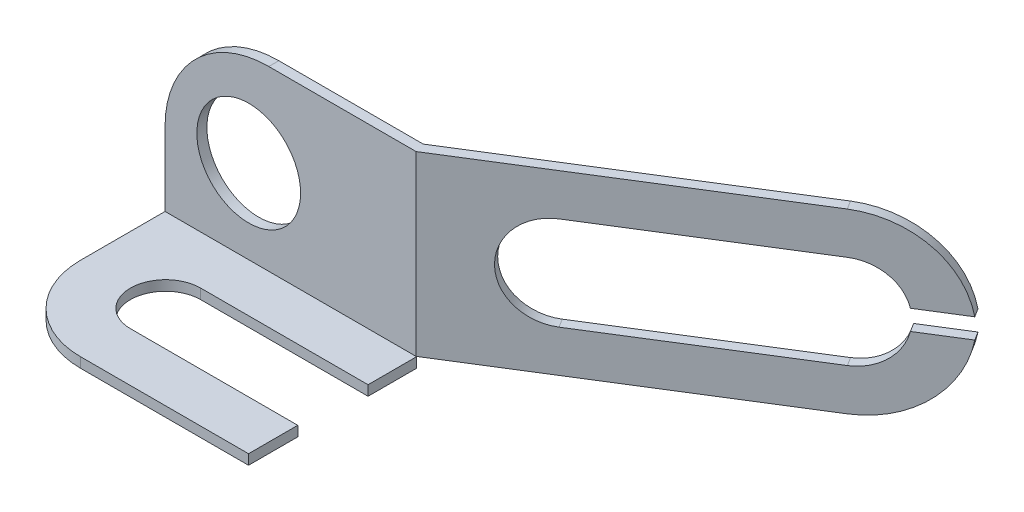
ISO-10303-21;
HEADER;
FILE_DESCRIPTION(('STEP AP214'),'2;1');
FILE_NAME('part.step','',(''),(''),'','','');
FILE_SCHEMA(('AUTOMOTIVE_DESIGN { 1 0 10303 214 1 1 1 1 }'));
ENDSEC;
DATA;
#1=APPLICATION_CONTEXT('core data for automotive mechanical design processes');
#2=APPLICATION_PROTOCOL_DEFINITION('international standard','automotive_design',2000,#1);
#3=PRODUCT_CONTEXT('',#1,'mechanical');
#4=PRODUCT('Part','Part','',(#3));
#5=PRODUCT_RELATED_PRODUCT_CATEGORY('part','',(#4));
#6=PRODUCT_DEFINITION_FORMATION('','',#4);
#7=PRODUCT_DEFINITION_CONTEXT('part definition',#1,'design');
#8=PRODUCT_DEFINITION('design','',#6,#7);
#9=PRODUCT_DEFINITION_SHAPE('','',#8);
#10=(LENGTH_UNIT() NAMED_UNIT(*) SI_UNIT(.MILLI.,.METRE.));
#11=(NAMED_UNIT(*) PLANE_ANGLE_UNIT() SI_UNIT($,.RADIAN.));
#12=(NAMED_UNIT(*) SI_UNIT($,.STERADIAN.) SOLID_ANGLE_UNIT());
#13=UNCERTAINTY_MEASURE_WITH_UNIT(LENGTH_MEASURE(1.E-05),#10,'distance_accuracy_value','');
#14=(GEOMETRIC_REPRESENTATION_CONTEXT(3) GLOBAL_UNCERTAINTY_ASSIGNED_CONTEXT((#13)) GLOBAL_UNIT_ASSIGNED_CONTEXT((#10,
#11,#12)) REPRESENTATION_CONTEXT('',''));
#15=CARTESIAN_POINT('',(0.,0.,0.));
#16=DIRECTION('',(0.,0.,1.));
#17=DIRECTION('',(1.,0.,0.));
#18=AXIS2_PLACEMENT_3D('',#15,#16,#17);
#19=CARTESIAN_POINT('',(0.116932518822949,0.44,-0.56));
#20=DIRECTION('',(0.,0.,-1.));
#21=DIRECTION('',(-1.,0.,0.));
#22=AXIS2_PLACEMENT_3D('',#19,#20,#21);
#23=PLANE('',#22);
#24=CARTESIAN_POINT('',(-0.00306748117705072,0.5,-0.56));
#25=DIRECTION('',(0.,0.,1.));
#26=DIRECTION('',(1.,0.,0.));
#27=AXIS2_PLACEMENT_3D('',#24,#25,#26);
#28=CIRCLE('',#27,0.31);
#29=CARTESIAN_POINT('',(0.306932518822949,0.5,-0.56));
#30=VERTEX_POINT('',#29);
#31=EDGE_CURVE('E290',#30,#30,#28,.T.);
#32=ORIENTED_EDGE('',*,*,#31,.T.);
#33=EDGE_LOOP('',(#32));
#34=FACE_BOUND('',#33,.T.);
#35=DIRECTION('',(-1.,0.,0.));
#36=VECTOR('',#35,1.);
#37=CARTESIAN_POINT('',(0.116932518822954,1.06,-0.56));
#38=LINE('',#37,#36);
#39=CARTESIAN_POINT('',(0.979727795677421,1.06,-0.56));
#40=VERTEX_POINT('',#39);
#41=CARTESIAN_POINT('',(0.116932518822954,1.06,-0.56));
#42=VERTEX_POINT('',#41);
#43=EDGE_CURVE('E93',#40,#42,#38,.T.);
#44=ORIENTED_EDGE('',*,*,#43,.F.);
#45=DIRECTION('',(0.,-1.,0.));
#46=VECTOR('',#45,1.);
#47=CARTESIAN_POINT('',(0.979727795677421,0.44,-0.56));
#48=LINE('',#47,#46);
#49=CARTESIAN_POINT('',(0.979727795677421,0.,-0.56));
#50=VERTEX_POINT('',#49);
#51=EDGE_CURVE('E12',#40,#50,#48,.T.);
#52=ORIENTED_EDGE('',*,*,#51,.T.);
#53=DIRECTION('',(1.,0.,0.));
#54=VECTOR('',#53,1.);
#55=CARTESIAN_POINT('',(-0.503067481177051,0.,-0.56));
#56=LINE('',#55,#54);
#57=CARTESIAN_POINT('',(-0.503067481177051,0.,-0.56));
#58=VERTEX_POINT('',#57);
#59=EDGE_CURVE('E167',#58,#50,#56,.T.);
#60=ORIENTED_EDGE('',*,*,#59,.F.);
#61=DIRECTION('',(0.,-1.,0.));
#62=VECTOR('',#61,1.);
#63=CARTESIAN_POINT('',(-0.503067481177051,0.,-0.56));
#64=LINE('',#63,#62);
#65=CARTESIAN_POINT('',(-0.503067481177051,0.439999999999996,-0.56));
#66=VERTEX_POINT('',#65);
#67=EDGE_CURVE('E306',#66,#58,#64,.T.);
#68=ORIENTED_EDGE('',*,*,#67,.F.);
#69=CARTESIAN_POINT('',(0.116932518822949,0.44,-0.56));
#70=DIRECTION('',(0.,0.,1.));
#71=DIRECTION('',(-1.,0.,0.));
#72=AXIS2_PLACEMENT_3D('',#69,#70,#71);
#73=CIRCLE('',#72,0.62);
#74=EDGE_CURVE('E303',#42,#66,#73,.T.);
#75=ORIENTED_EDGE('',*,*,#74,.F.);
#76=EDGE_LOOP('',(#44,#52,#60,#68,#75));
#77=FACE_BOUND('',#76,.T.);
#78=ADVANCED_FACE('F49',(#34,#77),#23,.T.);
#79=CARTESIAN_POINT('',(-0.503067481177051,0.,-0.56));
#80=DIRECTION('',(0.,-1.,0.));
#81=DIRECTION('',(0.,0.,-1.));
#82=AXIS2_PLACEMENT_3D('',#79,#80,#81);
#83=PLANE('',#82);
#84=DIRECTION('',(0.848048096156427,0.,-0.529919264233203));
#85=VECTOR('',#84,1.);
#86=CARTESIAN_POINT('',(0.99693251882295,0.,-0.5));
#87=LINE('',#86,#85);
#88=CARTESIAN_POINT('',(0.99693251882295,0.,-0.5));
#89=VERTEX_POINT('',#88);
#90=CARTESIAN_POINT('',(2.58278245863547,0.,-1.49094902411609));
#91=VERTEX_POINT('',#90);
#92=EDGE_CURVE('E224',#89,#91,#87,.T.);
#93=ORIENTED_EDGE('',*,*,#92,.F.);
#94=DIRECTION('',(1.,0.,0.));
#95=VECTOR('',#94,1.);
#96=CARTESIAN_POINT('',(-0.503067481177051,0.,-0.5));
#97=LINE('',#96,#95);
#98=CARTESIAN_POINT('',(-0.503067481177051,0.,-0.5));
#99=VERTEX_POINT('',#98);
#100=EDGE_CURVE('E294',#99,#89,#97,.T.);
#101=ORIENTED_EDGE('',*,*,#100,.F.);
#102=DIRECTION('',(0.,0.,1.));
#103=VECTOR('',#102,1.);
#104=CARTESIAN_POINT('',(-0.503067481177051,0.,-0.56));
#105=LINE('',#104,#103);
#106=EDGE_CURVE('E59',#58,#99,#105,.T.);
#107=ORIENTED_EDGE('',*,*,#106,.F.);
#108=ORIENTED_EDGE('',*,*,#59,.T.);
#109=DIRECTION('',(0.848048096156427,0.,-0.529919264233203));
#110=VECTOR('',#109,1.);
#111=CARTESIAN_POINT('',(0.965137362968957,0.,-0.550882885769386));
#112=LINE('',#111,#110);
#113=CARTESIAN_POINT('',(2.55098730278148,0.,-1.54183190988548));
#114=VERTEX_POINT('',#113);
#115=EDGE_CURVE('E163',#50,#114,#112,.T.);
#116=ORIENTED_EDGE('',*,*,#115,.T.);
#117=DIRECTION('',(0.529919264233203,0.,0.848048096156427));
#118=VECTOR('',#117,1.);
#119=CARTESIAN_POINT('',(2.55098730278148,0.,-1.54183190988548));
#120=LINE('',#119,#118);
#121=EDGE_CURVE('E165',#114,#91,#120,.T.);
#122=ORIENTED_EDGE('',*,*,#121,.T.);
#123=EDGE_LOOP('',(#93,#101,#107,#108,#116,#122));
#124=FACE_BOUND('',#123,.T.);
#125=ADVANCED_FACE('F51',(#124),#83,.T.);
#126=CARTESIAN_POINT('',(-0.503067481177051,0.,-0.56));
#127=DIRECTION('',(-1.,0.,0.));
#128=DIRECTION('',(0.,0.,1.));
#129=AXIS2_PLACEMENT_3D('',#126,#127,#128);
#130=PLANE('',#129);
#131=DIRECTION('',(0.,-1.,0.));
#132=VECTOR('',#131,1.);
#133=CARTESIAN_POINT('',(-0.503067481177051,0.,-0.5));
#134=LINE('',#133,#132);
#135=CARTESIAN_POINT('',(-0.503067481177051,0.439999999999996,-0.5));
#136=VERTEX_POINT('',#135);
#137=EDGE_CURVE('E300',#136,#99,#134,.T.);
#138=ORIENTED_EDGE('',*,*,#137,.F.);
#139=DIRECTION('',(0.,0.,1.));
#140=VECTOR('',#139,1.);
#141=CARTESIAN_POINT('',(-0.503067481177051,0.439999999999996,-0.56));
#142=LINE('',#141,#140);
#143=EDGE_CURVE('E84',#66,#136,#142,.T.);
#144=ORIENTED_EDGE('',*,*,#143,.F.);
#145=ORIENTED_EDGE('',*,*,#67,.T.);
#146=ORIENTED_EDGE('',*,*,#106,.T.);
#147=EDGE_LOOP('',(#138,#144,#145,#146));
#148=FACE_BOUND('',#147,.T.);
#149=ADVANCED_FACE('F349',(#148),#130,.T.);
#150=CARTESIAN_POINT('',(0.116932518822949,0.44,-0.56));
#151=DIRECTION('',(0.,0.,1.));
#152=DIRECTION('',(1.,0.,0.));
#153=AXIS2_PLACEMENT_3D('',#150,#151,#152);
#154=CYLINDRICAL_SURFACE('',#153,0.62);
#155=CARTESIAN_POINT('',(0.116932518822949,0.44,-0.5));
#156=DIRECTION('',(0.,0.,1.));
#157=DIRECTION('',(-1.,0.,0.));
#158=AXIS2_PLACEMENT_3D('',#155,#156,#157);
#159=CIRCLE('',#158,0.62);
#160=CARTESIAN_POINT('',(0.116932518822954,1.06,-0.5));
#161=VERTEX_POINT('',#160);
#162=EDGE_CURVE('E321',#161,#136,#159,.T.);
#163=ORIENTED_EDGE('',*,*,#162,.F.);
#164=DIRECTION('',(0.,0.,1.));
#165=VECTOR('',#164,1.);
#166=CARTESIAN_POINT('',(0.116932518822954,1.06,-0.56));
#167=LINE('',#166,#165);
#168=EDGE_CURVE('E309',#42,#161,#167,.T.);
#169=ORIENTED_EDGE('',*,*,#168,.F.);
#170=ORIENTED_EDGE('',*,*,#74,.T.);
#171=ORIENTED_EDGE('',*,*,#143,.T.);
#172=EDGE_LOOP('',(#163,#169,#170,#171));
#173=FACE_BOUND('',#172,.T.);
#174=ADVANCED_FACE('F335',(#173),#154,.T.);
#175=CARTESIAN_POINT('',(0.116932518822954,1.06,-0.56));
#176=DIRECTION('',(0.,1.,0.));
#177=DIRECTION('',(0.,0.,1.));
#178=AXIS2_PLACEMENT_3D('',#175,#176,#177);
#179=PLANE('',#178);
#180=DIRECTION('',(-1.,0.,0.));
#181=VECTOR('',#180,1.);
#182=CARTESIAN_POINT('',(0.116932518822954,1.06,-0.5));
#183=LINE('',#182,#181);
#184=CARTESIAN_POINT('',(0.996932518822949,1.06,-0.5));
#185=VERTEX_POINT('',#184);
#186=EDGE_CURVE('E317',#185,#161,#183,.T.);
#187=ORIENTED_EDGE('',*,*,#186,.F.);
#188=DIRECTION('',(-0.848048096156427,0.,0.529919264233203));
#189=VECTOR('',#188,1.);
#190=CARTESIAN_POINT('',(0.996932518822949,1.06,-0.5));
#191=LINE('',#190,#189);
#192=CARTESIAN_POINT('',(2.58278245863547,1.06,-1.49094902411609));
#193=VERTEX_POINT('',#192);
#194=EDGE_CURVE('E172',#193,#185,#191,.T.);
#195=ORIENTED_EDGE('',*,*,#194,.F.);
#196=DIRECTION('',(0.529919264233203,0.,0.848048096156427));
#197=VECTOR('',#196,1.);
#198=CARTESIAN_POINT('',(2.55098730278148,1.06,-1.54183190988548));
#199=LINE('',#198,#197);
#200=CARTESIAN_POINT('',(2.55098730278148,1.06,-1.54183190988548));
#201=VERTEX_POINT('',#200);
#202=EDGE_CURVE('E263',#201,#193,#199,.T.);
#203=ORIENTED_EDGE('',*,*,#202,.F.);
#204=DIRECTION('',(-0.848048096156427,0.,0.529919264233203));
#205=VECTOR('',#204,1.);
#206=CARTESIAN_POINT('',(0.965137362968957,1.06,-0.550882885769386));
#207=LINE('',#206,#205);
#208=EDGE_CURVE('E182',#201,#40,#207,.T.);
#209=ORIENTED_EDGE('',*,*,#208,.T.);
#210=ORIENTED_EDGE('',*,*,#43,.T.);
#211=ORIENTED_EDGE('',*,*,#168,.T.);
#212=EDGE_LOOP('',(#187,#195,#203,#209,#210,#211));
#213=FACE_BOUND('',#212,.T.);
#214=ADVANCED_FACE('F332',(#213),#179,.T.);
#215=CARTESIAN_POINT('',(0.116932518822949,0.44,-0.5));
#216=DIRECTION('',(0.,0.,-1.));
#217=DIRECTION('',(-1.,0.,0.));
#218=AXIS2_PLACEMENT_3D('',#215,#216,#217);
#219=PLANE('',#218);
#220=CARTESIAN_POINT('',(-0.00306748117705072,0.5,-0.5));
#221=DIRECTION('',(0.,0.,1.));
#222=DIRECTION('',(1.,0.,0.));
#223=AXIS2_PLACEMENT_3D('',#220,#221,#222);
#224=CIRCLE('',#223,0.31);
#225=CARTESIAN_POINT('',(0.306932518822949,0.5,-0.5));
#226=VERTEX_POINT('',#225);
#227=EDGE_CURVE('E266',#226,#226,#224,.T.);
#228=ORIENTED_EDGE('',*,*,#227,.F.);
#229=EDGE_LOOP('',(#228));
#230=FACE_BOUND('',#229,.T.);
#231=ORIENTED_EDGE('',*,*,#100,.T.);
#232=DIRECTION('',(0.,1.,0.));
#233=VECTOR('',#232,1.);
#234=CARTESIAN_POINT('',(0.996932518822949,1.06,-0.5));
#235=LINE('',#234,#233);
#236=EDGE_CURVE('E313',#89,#185,#235,.T.);
#237=ORIENTED_EDGE('',*,*,#236,.T.);
#238=ORIENTED_EDGE('',*,*,#186,.T.);
#239=ORIENTED_EDGE('',*,*,#162,.T.);
#240=ORIENTED_EDGE('',*,*,#137,.T.);
#241=EDGE_LOOP('',(#231,#237,#238,#239,#240));
#242=FACE_BOUND('',#241,.T.);
#243=ADVANCED_FACE('F337',(#230,#242),#219,.F.);
#244=CARTESIAN_POINT('',(-0.00306748117705072,0.5,-0.56));
#245=DIRECTION('',(0.,0.,1.));
#246=DIRECTION('',(1.,0.,0.));
#247=AXIS2_PLACEMENT_3D('',#244,#245,#246);
#248=CYLINDRICAL_SURFACE('',#247,0.31);
#249=ORIENTED_EDGE('',*,*,#31,.F.);
#250=EDGE_LOOP('',(#249));
#251=FACE_BOUND('',#250,.T.);
#252=ORIENTED_EDGE('',*,*,#227,.T.);
#253=EDGE_LOOP('',(#252));
#254=FACE_BOUND('',#253,.T.);
#255=ADVANCED_FACE('F364',(#251,#254),#248,.F.);
#256=CARTESIAN_POINT('',(2.55098730278148,0.5,-1.54183190988548));
#257=DIRECTION('',(0.529919264233203,0.,0.848048096156427));
#258=DIRECTION('',(0.848048096156427,0.,-0.529919264233203));
#259=AXIS2_PLACEMENT_3D('',#256,#257,#258);
#260=CYLINDRICAL_SURFACE('',#259,0.56);
#261=CARTESIAN_POINT('',(2.58278245863547,0.5,-1.49094902411609));
#262=DIRECTION('',(0.529919264233203,0.,0.848048096156427));
#263=DIRECTION('',(-0.848048096156427,0.,0.529919264233203));
#264=AXIS2_PLACEMENT_3D('',#261,#262,#263);
#265=CIRCLE('',#264,0.56);
#266=CARTESIAN_POINT('',(3.0515160638656,0.590000000000001,-1.78384628823436));
#267=VERTEX_POINT('',#266);
#268=EDGE_CURVE('E257',#267,#193,#265,.T.);
#269=ORIENTED_EDGE('',*,*,#268,.F.);
#270=DIRECTION('',(0.529919264233203,0.,0.848048096156427));
#271=VECTOR('',#270,1.);
#272=CARTESIAN_POINT('',(3.0197209080116,0.590000000000001,-1.83472917400375));
#273=LINE('',#272,#271);
#274=CARTESIAN_POINT('',(3.0197209080116,0.590000000000001,-1.83472917400375));
#275=VERTEX_POINT('',#274);
#276=EDGE_CURVE('E267',#275,#267,#273,.T.);
#277=ORIENTED_EDGE('',*,*,#276,.F.);
#278=CARTESIAN_POINT('',(2.55098730278148,0.5,-1.54183190988548));
#279=DIRECTION('',(0.529919264233203,0.,0.848048096156427));
#280=DIRECTION('',(-0.848048096156427,0.,0.529919264233203));
#281=AXIS2_PLACEMENT_3D('',#278,#279,#280);
#282=CIRCLE('',#281,0.56);
#283=EDGE_CURVE('E218',#275,#201,#282,.T.);
#284=ORIENTED_EDGE('',*,*,#283,.T.);
#285=ORIENTED_EDGE('',*,*,#202,.T.);
#286=EDGE_LOOP('',(#269,#277,#284,#285));
#287=FACE_BOUND('',#286,.T.);
#288=ADVANCED_FACE('F345',(#287),#260,.T.);
#289=CARTESIAN_POINT('',(3.0197209080116,0.590000000000001,-1.83472917400375));
#290=DIRECTION('',(0.,-1.,0.));
#291=DIRECTION('',(1.,0.,0.));
#292=AXIS2_PLACEMENT_3D('',#289,#290,#291);
#293=PLANE('',#292);
#294=DIRECTION('',(0.848048096156428,0.,-0.529919264233203));
#295=VECTOR('',#294,1.);
#296=CARTESIAN_POINT('',(3.0515160638656,0.590000000000001,-1.78384628823436));
#297=LINE('',#296,#295);
#298=CARTESIAN_POINT('',(2.81472012459318,0.59,-1.63587976312645));
#299=VERTEX_POINT('',#298);
#300=EDGE_CURVE('E253',#299,#267,#297,.T.);
#301=ORIENTED_EDGE('',*,*,#300,.F.);
#302=DIRECTION('',(0.529919264233203,0.,0.848048096156427));
#303=VECTOR('',#302,1.);
#304=CARTESIAN_POINT('',(2.78292496873919,0.59,-1.68676264889583));
#305=LINE('',#304,#303);
#306=CARTESIAN_POINT('',(2.78292496873919,0.59,-1.68676264889583));
#307=VERTEX_POINT('',#306);
#308=EDGE_CURVE('E270',#307,#299,#305,.T.);
#309=ORIENTED_EDGE('',*,*,#308,.F.);
#310=DIRECTION('',(0.848048096156428,0.,-0.529919264233203));
#311=VECTOR('',#310,1.);
#312=CARTESIAN_POINT('',(3.0197209080116,0.590000000000001,-1.83472917400375));
#313=LINE('',#312,#311);
#314=EDGE_CURVE('E214',#307,#275,#313,.T.);
#315=ORIENTED_EDGE('',*,*,#314,.T.);
#316=ORIENTED_EDGE('',*,*,#276,.T.);
#317=EDGE_LOOP('',(#301,#309,#315,#316));
#318=FACE_BOUND('',#317,.T.);
#319=ADVANCED_FACE('F418',(#318),#293,.T.);
#320=CARTESIAN_POINT('',(2.55098730278148,0.53,-1.54183190988548));
#321=DIRECTION('',(0.529919264233203,0.,0.848048096156427));
#322=DIRECTION('',(0.848048096156427,0.,-0.529919264233203));
#323=AXIS2_PLACEMENT_3D('',#320,#321,#322);
#324=CYLINDRICAL_SURFACE('',#323,0.28);
#325=CARTESIAN_POINT('',(2.58278245863547,0.53,-1.49094902411609));
#326=DIRECTION('',(-0.529919264233203,0.,-0.848048096156427));
#327=DIRECTION('',(0.848048096156427,0.,-0.529919264233203));
#328=AXIS2_PLACEMENT_3D('',#325,#326,#327);
#329=CIRCLE('',#328,0.28);
#330=CARTESIAN_POINT('',(2.58278245863547,0.81,-1.49094902411609));
#331=VERTEX_POINT('',#330);
#332=EDGE_CURVE('E249',#331,#299,#329,.T.);
#333=ORIENTED_EDGE('',*,*,#332,.F.);
#334=DIRECTION('',(0.529919264233203,0.,0.848048096156427));
#335=VECTOR('',#334,1.);
#336=CARTESIAN_POINT('',(2.55098730278148,0.81,-1.54183190988548));
#337=LINE('',#336,#335);
#338=CARTESIAN_POINT('',(2.55098730278148,0.81,-1.54183190988548));
#339=VERTEX_POINT('',#338);
#340=EDGE_CURVE('E273',#339,#331,#337,.T.);
#341=ORIENTED_EDGE('',*,*,#340,.F.);
#342=CARTESIAN_POINT('',(2.55098730278148,0.53,-1.54183190988548));
#343=DIRECTION('',(-0.529919264233203,0.,-0.848048096156427));
#344=DIRECTION('',(0.848048096156427,0.,-0.529919264233203));
#345=AXIS2_PLACEMENT_3D('',#342,#343,#344);
#346=CIRCLE('',#345,0.28);
#347=EDGE_CURVE('E210',#339,#307,#346,.T.);
#348=ORIENTED_EDGE('',*,*,#347,.T.);
#349=ORIENTED_EDGE('',*,*,#308,.T.);
#350=EDGE_LOOP('',(#333,#341,#348,#349));
#351=FACE_BOUND('',#350,.T.);
#352=ADVANCED_FACE('F426',(#351),#324,.F.);
#353=CARTESIAN_POINT('',(1.49092718258594,0.81,-0.879432829593972));
#354=DIRECTION('',(0.,-1.,0.));
#355=DIRECTION('',(1.,0.,0.));
#356=AXIS2_PLACEMENT_3D('',#353,#354,#355);
#357=PLANE('',#356);
#358=DIRECTION('',(0.848048096156427,0.,-0.529919264233203));
#359=VECTOR('',#358,1.);
#360=CARTESIAN_POINT('',(1.52272233843993,0.81,-0.828549943824586));
#361=LINE('',#360,#359);
#362=CARTESIAN_POINT('',(1.52272233843993,0.81,-0.828549943824586));
#363=VERTEX_POINT('',#362);
#364=EDGE_CURVE('E245',#363,#331,#361,.T.);
#365=ORIENTED_EDGE('',*,*,#364,.F.);
#366=DIRECTION('',(0.529919264233203,0.,0.848048096156427));
#367=VECTOR('',#366,1.);
#368=CARTESIAN_POINT('',(1.49092718258594,0.81,-0.879432829593972));
#369=LINE('',#368,#367);
#370=CARTESIAN_POINT('',(1.49092718258594,0.81,-0.879432829593972));
#371=VERTEX_POINT('',#370);
#372=EDGE_CURVE('E276',#371,#363,#369,.T.);
#373=ORIENTED_EDGE('',*,*,#372,.F.);
#374=DIRECTION('',(0.848048096156427,0.,-0.529919264233203));
#375=VECTOR('',#374,1.);
#376=CARTESIAN_POINT('',(1.49092718258594,0.81,-0.879432829593972));
#377=LINE('',#376,#375);
#378=EDGE_CURVE('E206',#371,#339,#377,.T.);
#379=ORIENTED_EDGE('',*,*,#378,.T.);
#380=ORIENTED_EDGE('',*,*,#340,.T.);
#381=EDGE_LOOP('',(#365,#373,#379,#380));
#382=FACE_BOUND('',#381,.T.);
#383=ADVANCED_FACE('F435',(#382),#357,.T.);
#384=CARTESIAN_POINT('',(1.49092718258594,0.53,-0.879432829593972));
#385=DIRECTION('',(0.529919264233203,0.,0.848048096156427));
#386=DIRECTION('',(0.848048096156427,0.,-0.529919264233203));
#387=AXIS2_PLACEMENT_3D('',#384,#385,#386);
#388=CYLINDRICAL_SURFACE('',#387,0.28);
#389=CARTESIAN_POINT('',(1.52272233843993,0.53,-0.828549943824586));
#390=DIRECTION('',(-0.529919264233203,0.,-0.848048096156427));
#391=DIRECTION('',(0.848048096156427,0.,-0.529919264233203));
#392=AXIS2_PLACEMENT_3D('',#389,#390,#391);
#393=CIRCLE('',#392,0.28);
#394=CARTESIAN_POINT('',(1.52272233843993,0.25,-0.828549943824586));
#395=VERTEX_POINT('',#394);
#396=EDGE_CURVE('E241',#395,#363,#393,.T.);
#397=ORIENTED_EDGE('',*,*,#396,.F.);
#398=DIRECTION('',(0.529919264233203,0.,0.848048096156427));
#399=VECTOR('',#398,1.);
#400=CARTESIAN_POINT('',(1.49092718258594,0.25,-0.879432829593972));
#401=LINE('',#400,#399);
#402=CARTESIAN_POINT('',(1.49092718258594,0.25,-0.879432829593972));
#403=VERTEX_POINT('',#402);
#404=EDGE_CURVE('E279',#403,#395,#401,.T.);
#405=ORIENTED_EDGE('',*,*,#404,.F.);
#406=CARTESIAN_POINT('',(1.49092718258594,0.53,-0.879432829593972));
#407=DIRECTION('',(-0.529919264233203,0.,-0.848048096156427));
#408=DIRECTION('',(0.848048096156427,0.,-0.529919264233203));
#409=AXIS2_PLACEMENT_3D('',#406,#407,#408);
#410=CIRCLE('',#409,0.28);
#411=EDGE_CURVE('E202',#403,#371,#410,.T.);
#412=ORIENTED_EDGE('',*,*,#411,.T.);
#413=ORIENTED_EDGE('',*,*,#372,.T.);
#414=EDGE_LOOP('',(#397,#405,#412,#413));
#415=FACE_BOUND('',#414,.T.);
#416=ADVANCED_FACE('F444',(#415),#388,.F.);
#417=CARTESIAN_POINT('',(1.49092718258594,0.25,-0.879432829593972));
#418=DIRECTION('',(0.,1.,0.));
#419=DIRECTION('',(-1.,0.,0.));
#420=AXIS2_PLACEMENT_3D('',#417,#418,#419);
#421=PLANE('',#420);
#422=DIRECTION('',(-0.848048096156427,0.,0.529919264233203));
#423=VECTOR('',#422,1.);
#424=CARTESIAN_POINT('',(1.52272233843993,0.25,-0.828549943824586));
#425=LINE('',#424,#423);
#426=CARTESIAN_POINT('',(2.58278245863547,0.25,-1.49094902411609));
#427=VERTEX_POINT('',#426);
#428=EDGE_CURVE('E237',#427,#395,#425,.T.);
#429=ORIENTED_EDGE('',*,*,#428,.F.);
#430=DIRECTION('',(0.529919264233203,0.,0.848048096156427));
#431=VECTOR('',#430,1.);
#432=CARTESIAN_POINT('',(2.55098730278148,0.25,-1.54183190988548));
#433=LINE('',#432,#431);
#434=CARTESIAN_POINT('',(2.55098730278148,0.25,-1.54183190988548));
#435=VERTEX_POINT('',#434);
#436=EDGE_CURVE('E282',#435,#427,#433,.T.);
#437=ORIENTED_EDGE('',*,*,#436,.F.);
#438=DIRECTION('',(-0.848048096156427,0.,0.529919264233203));
#439=VECTOR('',#438,1.);
#440=CARTESIAN_POINT('',(1.49092718258594,0.25,-0.879432829593972));
#441=LINE('',#440,#439);
#442=EDGE_CURVE('E198',#435,#403,#441,.T.);
#443=ORIENTED_EDGE('',*,*,#442,.T.);
#444=ORIENTED_EDGE('',*,*,#404,.T.);
#445=EDGE_LOOP('',(#429,#437,#443,#444));
#446=FACE_BOUND('',#445,.T.);
#447=ADVANCED_FACE('F453',(#446),#421,.T.);
#448=CARTESIAN_POINT('',(2.55098730278148,0.53,-1.54183190988548));
#449=DIRECTION('',(0.529919264233203,0.,0.848048096156427));
#450=DIRECTION('',(0.848048096156427,0.,-0.529919264233203));
#451=AXIS2_PLACEMENT_3D('',#448,#449,#450);
#452=CYLINDRICAL_SURFACE('',#451,0.28);
#453=CARTESIAN_POINT('',(2.58278245863547,0.53,-1.49094902411609));
#454=DIRECTION('',(-0.529919264233203,0.,-0.848048096156427));
#455=DIRECTION('',(0.848048096156427,0.,-0.529919264233203));
#456=AXIS2_PLACEMENT_3D('',#453,#454,#455);
#457=CIRCLE('',#456,0.28);
#458=CARTESIAN_POINT('',(2.81472012459318,0.47,-1.63587976312645));
#459=VERTEX_POINT('',#458);
#460=EDGE_CURVE('E233',#459,#427,#457,.T.);
#461=ORIENTED_EDGE('',*,*,#460,.F.);
#462=DIRECTION('',(0.529919264233203,0.,0.848048096156427));
#463=VECTOR('',#462,1.);
#464=CARTESIAN_POINT('',(2.78292496873919,0.47,-1.68676264889583));
#465=LINE('',#464,#463);
#466=CARTESIAN_POINT('',(2.78292496873919,0.47,-1.68676264889583));
#467=VERTEX_POINT('',#466);
#468=EDGE_CURVE('E285',#467,#459,#465,.T.);
#469=ORIENTED_EDGE('',*,*,#468,.F.);
#470=CARTESIAN_POINT('',(2.55098730278148,0.53,-1.54183190988548));
#471=DIRECTION('',(-0.529919264233203,0.,-0.848048096156427));
#472=DIRECTION('',(0.848048096156427,0.,-0.529919264233203));
#473=AXIS2_PLACEMENT_3D('',#470,#471,#472);
#474=CIRCLE('',#473,0.28);
#475=EDGE_CURVE('E192',#467,#435,#474,.T.);
#476=ORIENTED_EDGE('',*,*,#475,.T.);
#477=ORIENTED_EDGE('',*,*,#436,.T.);
#478=EDGE_LOOP('',(#461,#469,#476,#477));
#479=FACE_BOUND('',#478,.T.);
#480=ADVANCED_FACE('F462',(#479),#452,.F.);
#481=CARTESIAN_POINT('',(2.78292496873919,0.47,-1.68676264889583));
#482=DIRECTION('',(0.,1.,0.));
#483=DIRECTION('',(-1.,0.,0.));
#484=AXIS2_PLACEMENT_3D('',#481,#482,#483);
#485=PLANE('',#484);
#486=DIRECTION('',(-0.848048096156427,0.,0.529919264233203));
#487=VECTOR('',#486,1.);
#488=CARTESIAN_POINT('',(2.81472012459318,0.47,-1.63587976312645));
#489=LINE('',#488,#487);
#490=CARTESIAN_POINT('',(3.05151606386445,0.47,-1.78384628823365));
#491=VERTEX_POINT('',#490);
#492=EDGE_CURVE('E229',#491,#459,#489,.T.);
#493=ORIENTED_EDGE('',*,*,#492,.F.);
#494=DIRECTION('',(0.529919264233203,0.,0.848048096156427));
#495=VECTOR('',#494,1.);
#496=CARTESIAN_POINT('',(3.01972090801046,0.47,-1.83472917400303));
#497=LINE('',#496,#495);
#498=CARTESIAN_POINT('',(3.01972090801046,0.47,-1.83472917400303));
#499=VERTEX_POINT('',#498);
#500=EDGE_CURVE('E181',#499,#491,#497,.T.);
#501=ORIENTED_EDGE('',*,*,#500,.F.);
#502=DIRECTION('',(-0.848048096156427,0.,0.529919264233203));
#503=VECTOR('',#502,1.);
#504=CARTESIAN_POINT('',(2.78292496873919,0.47,-1.68676264889583));
#505=LINE('',#504,#503);
#506=EDGE_CURVE('E188',#499,#467,#505,.T.);
#507=ORIENTED_EDGE('',*,*,#506,.T.);
#508=ORIENTED_EDGE('',*,*,#468,.T.);
#509=EDGE_LOOP('',(#493,#501,#507,#508));
#510=FACE_BOUND('',#509,.T.);
#511=ADVANCED_FACE('F471',(#510),#485,.T.);
#512=CARTESIAN_POINT('',(2.55098730278148,0.559999999998418,-1.54183190988548));
#513=DIRECTION('',(0.529919264233203,0.,0.848048096156427));
#514=DIRECTION('',(0.848048096156427,0.,-0.529919264233203));
#515=AXIS2_PLACEMENT_3D('',#512,#513,#514);
#516=CYLINDRICAL_SURFACE('',#515,0.559999999998417);
#517=CARTESIAN_POINT('',(2.58278245863547,0.559999999998418,-1.49094902411609));
#518=DIRECTION('',(0.529919264233203,0.,0.848048096156427));
#519=DIRECTION('',(0.848048096156427,0.,-0.529919264233203));
#520=AXIS2_PLACEMENT_3D('',#517,#518,#519);
#521=CIRCLE('',#520,0.559999999998417);
#522=EDGE_CURVE('E178',#91,#491,#521,.T.);
#523=ORIENTED_EDGE('',*,*,#522,.F.);
#524=ORIENTED_EDGE('',*,*,#121,.F.);
#525=CARTESIAN_POINT('',(2.55098730278148,0.559999999998418,-1.54183190988548));
#526=DIRECTION('',(0.529919264233203,0.,0.848048096156427));
#527=DIRECTION('',(0.848048096156427,0.,-0.529919264233203));
#528=AXIS2_PLACEMENT_3D('',#525,#526,#527);
#529=CIRCLE('',#528,0.559999999998417);
#530=EDGE_CURVE('E171',#114,#499,#529,.T.);
#531=ORIENTED_EDGE('',*,*,#530,.T.);
#532=ORIENTED_EDGE('',*,*,#500,.T.);
#533=EDGE_LOOP('',(#523,#524,#531,#532));
#534=FACE_BOUND('',#533,.T.);
#535=ADVANCED_FACE('F176',(#534),#516,.T.);
#536=CARTESIAN_POINT('',(2.55098730278148,0.559999999998418,-1.54183190988548));
#537=DIRECTION('',(0.529919264233203,0.,0.848048096156427));
#538=DIRECTION('',(0.848048096156427,0.,-0.529919264233203));
#539=AXIS2_PLACEMENT_3D('',#536,#537,#538);
#540=PLANE('',#539);
#541=ORIENTED_EDGE('',*,*,#51,.F.);
#542=ORIENTED_EDGE('',*,*,#208,.F.);
#543=ORIENTED_EDGE('',*,*,#283,.F.);
#544=ORIENTED_EDGE('',*,*,#314,.F.);
#545=ORIENTED_EDGE('',*,*,#347,.F.);
#546=ORIENTED_EDGE('',*,*,#378,.F.);
#547=ORIENTED_EDGE('',*,*,#411,.F.);
#548=ORIENTED_EDGE('',*,*,#442,.F.);
#549=ORIENTED_EDGE('',*,*,#475,.F.);
#550=ORIENTED_EDGE('',*,*,#506,.F.);
#551=ORIENTED_EDGE('',*,*,#530,.F.);
#552=ORIENTED_EDGE('',*,*,#115,.F.);
#553=EDGE_LOOP('',(#541,#542,#543,#544,#545,#546,#547,#548,#549,#550,#551,#552));
#554=FACE_BOUND('',#553,.T.);
#555=ADVANCED_FACE('F185',(#554),#540,.F.);
#556=CARTESIAN_POINT('',(2.58278245863547,0.559999999998418,-1.49094902411609));
#557=DIRECTION('',(0.529919264233203,0.,0.848048096156427));
#558=DIRECTION('',(0.848048096156427,0.,-0.529919264233203));
#559=AXIS2_PLACEMENT_3D('',#556,#557,#558);
#560=PLANE('',#559);
#561=ORIENTED_EDGE('',*,*,#236,.F.);
#562=ORIENTED_EDGE('',*,*,#92,.T.);
#563=ORIENTED_EDGE('',*,*,#522,.T.);
#564=ORIENTED_EDGE('',*,*,#492,.T.);
#565=ORIENTED_EDGE('',*,*,#460,.T.);
#566=ORIENTED_EDGE('',*,*,#428,.T.);
#567=ORIENTED_EDGE('',*,*,#396,.T.);
#568=ORIENTED_EDGE('',*,*,#364,.T.);
#569=ORIENTED_EDGE('',*,*,#332,.T.);
#570=ORIENTED_EDGE('',*,*,#300,.T.);
#571=ORIENTED_EDGE('',*,*,#268,.T.);
#572=ORIENTED_EDGE('',*,*,#194,.T.);
#573=EDGE_LOOP('',(#561,#562,#563,#564,#565,#566,#567,#568,#569,#570,#571,#572));
#574=FACE_BOUND('',#573,.T.);
#575=ADVANCED_FACE('F340',(#574),#560,.T.);
#576=CLOSED_SHELL('',(#78,#125,#149,#174,#214,#243,#255,#288,#319,#352,#383,#416,#447,#480,#511,
#535,#555,#575));
#577=MANIFOLD_SOLID_BREP('B2',#576);
#578=CARTESIAN_POINT('',(0.,-0.06,0.));
#579=DIRECTION('',(0.,1.,0.));
#580=DIRECTION('',(0.,0.,1.));
#581=AXIS2_PLACEMENT_3D('',#578,#579,#580);
#582=CYLINDRICAL_SURFACE('',#581,0.209999996463786);
#583=CARTESIAN_POINT('',(0.,0.,0.));
#584=DIRECTION('',(0.,-1.,0.));
#585=DIRECTION('',(0.,0.,1.));
#586=AXIS2_PLACEMENT_3D('',#583,#584,#585);
#587=CIRCLE('',#586,0.209999996463786);
#588=CARTESIAN_POINT('',(0.,0.,0.21));
#589=VERTEX_POINT('',#588);
#590=CARTESIAN_POINT('',(0.,0.,-0.209999992927573));
#591=VERTEX_POINT('',#590);
#592=EDGE_CURVE('E636',#589,#591,#587,.T.);
#593=ORIENTED_EDGE('',*,*,#592,.F.);
#594=DIRECTION('',(0.,1.,0.));
#595=VECTOR('',#594,1.);
#596=CARTESIAN_POINT('',(0.,-0.06,0.21));
#597=LINE('',#596,#595);
#598=CARTESIAN_POINT('',(0.,-0.06,0.21));
#599=VERTEX_POINT('',#598);
#600=EDGE_CURVE('E47',#599,#589,#597,.T.);
#601=ORIENTED_EDGE('',*,*,#600,.F.);
#602=CARTESIAN_POINT('',(0.,-0.06,0.));
#603=DIRECTION('',(0.,-1.,0.));
#604=DIRECTION('',(0.,0.,1.));
#605=AXIS2_PLACEMENT_3D('',#602,#603,#604);
#606=CIRCLE('',#605,0.209999996463786);
#607=CARTESIAN_POINT('',(0.,-0.06,-0.209999992927573));
#608=VERTEX_POINT('',#607);
#609=EDGE_CURVE('E659',#599,#608,#606,.T.);
#610=ORIENTED_EDGE('',*,*,#609,.T.);
#611=DIRECTION('',(0.,1.,0.));
#612=VECTOR('',#611,1.);
#613=CARTESIAN_POINT('',(0.,-0.06,-0.209999992927573));
#614=LINE('',#613,#612);
#615=EDGE_CURVE('E536',#608,#591,#614,.T.);
#616=ORIENTED_EDGE('',*,*,#615,.T.);
#617=EDGE_LOOP('',(#593,#601,#610,#616));
#618=FACE_BOUND('',#617,.T.);
#619=ADVANCED_FACE('F533',(#618),#582,.F.);
#620=CARTESIAN_POINT('',(0.,-0.06,0.21));
#621=DIRECTION('',(0.,0.,-1.));
#622=DIRECTION('',(-1.,0.,0.));
#623=AXIS2_PLACEMENT_3D('',#620,#621,#622);
#624=PLANE('',#623);
#625=DIRECTION('',(-1.,0.,0.));
#626=VECTOR('',#625,1.);
#627=CARTESIAN_POINT('',(0.,0.,0.21));
#628=LINE('',#627,#626);
#629=CARTESIAN_POINT('',(0.999999999999999,0.,0.21));
#630=VERTEX_POINT('',#629);
#631=EDGE_CURVE('E657',#630,#589,#628,.T.);
#632=ORIENTED_EDGE('',*,*,#631,.F.);
#633=DIRECTION('',(0.,1.,0.));
#634=VECTOR('',#633,1.);
#635=CARTESIAN_POINT('',(0.999999999999999,-0.06,0.21));
#636=LINE('',#635,#634);
#637=CARTESIAN_POINT('',(0.999999999999999,-0.06,0.21));
#638=VERTEX_POINT('',#637);
#639=EDGE_CURVE('E542',#638,#630,#636,.T.);
#640=ORIENTED_EDGE('',*,*,#639,.F.);
#641=DIRECTION('',(-1.,0.,0.));
#642=VECTOR('',#641,1.);
#643=CARTESIAN_POINT('',(0.,-0.06,0.21));
#644=LINE('',#643,#642);
#645=EDGE_CURVE('E626',#638,#599,#644,.T.);
#646=ORIENTED_EDGE('',*,*,#645,.T.);
#647=ORIENTED_EDGE('',*,*,#600,.T.);
#648=EDGE_LOOP('',(#632,#640,#646,#647));
#649=FACE_BOUND('',#648,.T.);
#650=ADVANCED_FACE('F673',(#649),#624,.T.);
#651=CARTESIAN_POINT('',(0.999999999999999,-0.06,0.21));
#652=DIRECTION('',(1.,0.,0.));
#653=DIRECTION('',(0.,0.,-1.));
#654=AXIS2_PLACEMENT_3D('',#651,#652,#653);
#655=PLANE('',#654);
#656=DIRECTION('',(0.,0.,-1.));
#657=VECTOR('',#656,1.);
#658=CARTESIAN_POINT('',(0.999999999999999,0.,0.21));
#659=LINE('',#658,#657);
#660=CARTESIAN_POINT('',(0.999999999999997,0.,0.504131750780864));
#661=VERTEX_POINT('',#660);
#662=EDGE_CURVE('E613',#661,#630,#659,.T.);
#663=ORIENTED_EDGE('',*,*,#662,.F.);
#664=DIRECTION('',(0.,1.,0.));
#665=VECTOR('',#664,1.);
#666=CARTESIAN_POINT('',(0.999999999999997,-0.06,0.504131750780864));
#667=LINE('',#666,#665);
#668=CARTESIAN_POINT('',(0.999999999999997,-0.06,0.504131750780864));
#669=VERTEX_POINT('',#668);
#670=EDGE_CURVE('E608',#669,#661,#667,.T.);
#671=ORIENTED_EDGE('',*,*,#670,.F.);
#672=DIRECTION('',(0.,0.,-1.));
#673=VECTOR('',#672,1.);
#674=CARTESIAN_POINT('',(0.999999999999999,-0.06,0.21));
#675=LINE('',#674,#673);
#676=EDGE_CURVE('E611',#669,#638,#675,.T.);
#677=ORIENTED_EDGE('',*,*,#676,.T.);
#678=ORIENTED_EDGE('',*,*,#639,.T.);
#679=EDGE_LOOP('',(#663,#671,#677,#678));
#680=FACE_BOUND('',#679,.T.);
#681=ADVANCED_FACE('F610',(#680),#655,.T.);
#682=CARTESIAN_POINT('',(-0.0030674811770506,-0.06,0.504131750780865));
#683=DIRECTION('',(0.,0.,1.));
#684=DIRECTION('',(1.,0.,0.));
#685=AXIS2_PLACEMENT_3D('',#682,#683,#684);
#686=PLANE('',#685);
#687=DIRECTION('',(1.,0.,0.));
#688=VECTOR('',#687,1.);
#689=CARTESIAN_POINT('',(-0.0030674811770506,0.,0.504131750780865));
#690=LINE('',#689,#688);
#691=CARTESIAN_POINT('',(-0.0030674811770506,0.,0.504131750780865));
#692=VERTEX_POINT('',#691);
#693=EDGE_CURVE('E654',#692,#661,#690,.T.);
#694=ORIENTED_EDGE('',*,*,#693,.F.);
#695=DIRECTION('',(0.,1.,0.));
#696=VECTOR('',#695,1.);
#697=CARTESIAN_POINT('',(-0.0030674811770506,-0.06,0.504131750780865));
#698=LINE('',#697,#696);
#699=CARTESIAN_POINT('',(-0.0030674811770506,-0.06,0.504131750780865));
#700=VERTEX_POINT('',#699);
#701=EDGE_CURVE('E618',#700,#692,#698,.T.);
#702=ORIENTED_EDGE('',*,*,#701,.F.);
#703=DIRECTION('',(1.,0.,0.));
#704=VECTOR('',#703,1.);
#705=CARTESIAN_POINT('',(-0.0030674811770506,-0.06,0.504131750780865));
#706=LINE('',#705,#704);
#707=EDGE_CURVE('E624',#700,#669,#706,.T.);
#708=ORIENTED_EDGE('',*,*,#707,.T.);
#709=ORIENTED_EDGE('',*,*,#670,.T.);
#710=EDGE_LOOP('',(#694,#702,#708,#709));
#711=FACE_BOUND('',#710,.T.);
#712=ADVANCED_FACE('F628',(#711),#686,.T.);
#713=CARTESIAN_POINT('',(-0.00306748117705072,-0.06,0.00413175078086466));
#714=DIRECTION('',(0.,1.,0.));
#715=DIRECTION('',(0.,0.,1.));
#716=AXIS2_PLACEMENT_3D('',#713,#714,#715);
#717=CYLINDRICAL_SURFACE('',#716,0.5);
#718=CARTESIAN_POINT('',(-0.00306748117705072,0.,0.00413175078086466));
#719=DIRECTION('',(0.,1.,0.));
#720=DIRECTION('',(0.,0.,-1.));
#721=AXIS2_PLACEMENT_3D('',#718,#719,#720);
#722=CIRCLE('',#721,0.5);
#723=CARTESIAN_POINT('',(-0.503067481177051,0.,0.00413175078086475));
#724=VERTEX_POINT('',#723);
#725=EDGE_CURVE('E651',#724,#692,#722,.T.);
#726=ORIENTED_EDGE('',*,*,#725,.F.);
#727=DIRECTION('',(0.,1.,0.));
#728=VECTOR('',#727,1.);
#729=CARTESIAN_POINT('',(-0.503067481177051,-0.06,0.00413175078086475));
#730=LINE('',#729,#728);
#731=CARTESIAN_POINT('',(-0.503067481177051,-0.06,0.00413175078086475));
#732=VERTEX_POINT('',#731);
#733=EDGE_CURVE('E663',#732,#724,#730,.T.);
#734=ORIENTED_EDGE('',*,*,#733,.F.);
#735=CARTESIAN_POINT('',(-0.00306748117705072,-0.06,0.00413175078086466));
#736=DIRECTION('',(0.,1.,0.));
#737=DIRECTION('',(0.,0.,-1.));
#738=AXIS2_PLACEMENT_3D('',#735,#736,#737);
#739=CIRCLE('',#738,0.5);
#740=EDGE_CURVE('E629',#732,#700,#739,.T.);
#741=ORIENTED_EDGE('',*,*,#740,.T.);
#742=ORIENTED_EDGE('',*,*,#701,.T.);
#743=EDGE_LOOP('',(#726,#734,#741,#742));
#744=FACE_BOUND('',#743,.T.);
#745=ADVANCED_FACE('F686',(#744),#717,.T.);
#746=CARTESIAN_POINT('',(-0.503067481177051,-0.06,0.00413175078086466));
#747=DIRECTION('',(-1.,0.,0.));
#748=DIRECTION('',(0.,0.,1.));
#749=AXIS2_PLACEMENT_3D('',#746,#747,#748);
#750=PLANE('',#749);
#751=DIRECTION('',(0.,0.,1.));
#752=VECTOR('',#751,1.);
#753=CARTESIAN_POINT('',(-0.503067481177051,0.,0.00413175078086466));
#754=LINE('',#753,#752);
#755=CARTESIAN_POINT('',(-0.503067481177051,0.,-0.5));
#756=VERTEX_POINT('',#755);
#757=EDGE_CURVE('E648',#756,#724,#754,.T.);
#758=ORIENTED_EDGE('',*,*,#757,.F.);
#759=DIRECTION('',(0.,1.,0.));
#760=VECTOR('',#759,1.);
#761=CARTESIAN_POINT('',(-0.503067481177051,-0.06,-0.5));
#762=LINE('',#761,#760);
#763=CARTESIAN_POINT('',(-0.503067481177051,-0.06,-0.5));
#764=VERTEX_POINT('',#763);
#765=EDGE_CURVE('E665',#764,#756,#762,.T.);
#766=ORIENTED_EDGE('',*,*,#765,.F.);
#767=DIRECTION('',(0.,0.,1.));
#768=VECTOR('',#767,1.);
#769=CARTESIAN_POINT('',(-0.503067481177051,-0.06,0.00413175078086466));
#770=LINE('',#769,#768);
#771=EDGE_CURVE('E631',#764,#732,#770,.T.);
#772=ORIENTED_EDGE('',*,*,#771,.T.);
#773=ORIENTED_EDGE('',*,*,#733,.T.);
#774=EDGE_LOOP('',(#758,#766,#772,#773));
#775=FACE_BOUND('',#774,.T.);
#776=ADVANCED_FACE('F689',(#775),#750,.T.);
#777=CARTESIAN_POINT('',(1.,-0.06,-0.5));
#778=DIRECTION('',(0.,0.,-1.));
#779=DIRECTION('',(-1.,0.,0.));
#780=AXIS2_PLACEMENT_3D('',#777,#778,#779);
#781=PLANE('',#780);
#782=DIRECTION('',(-1.,0.,0.));
#783=VECTOR('',#782,1.);
#784=CARTESIAN_POINT('',(1.,0.,-0.5));
#785=LINE('',#784,#783);
#786=CARTESIAN_POINT('',(1.,0.,-0.5));
#787=VERTEX_POINT('',#786);
#788=EDGE_CURVE('E645',#787,#756,#785,.T.);
#789=ORIENTED_EDGE('',*,*,#788,.F.);
#790=DIRECTION('',(0.,1.,0.));
#791=VECTOR('',#790,1.);
#792=CARTESIAN_POINT('',(1.,-0.06,-0.5));
#793=LINE('',#792,#791);
#794=CARTESIAN_POINT('',(1.,-0.06,-0.5));
#795=VERTEX_POINT('',#794);
#796=EDGE_CURVE('E667',#795,#787,#793,.T.);
#797=ORIENTED_EDGE('',*,*,#796,.F.);
#798=DIRECTION('',(-1.,0.,0.));
#799=VECTOR('',#798,1.);
#800=CARTESIAN_POINT('',(1.,-0.06,-0.5));
#801=LINE('',#800,#799);
#802=EDGE_CURVE('E774',#795,#764,#801,.T.);
#803=ORIENTED_EDGE('',*,*,#802,.T.);
#804=ORIENTED_EDGE('',*,*,#765,.T.);
#805=EDGE_LOOP('',(#789,#797,#803,#804));
#806=FACE_BOUND('',#805,.T.);
#807=ADVANCED_FACE('F693',(#806),#781,.T.);
#808=CARTESIAN_POINT('',(1.,-0.06,-0.5));
#809=DIRECTION('',(1.,0.,0.));
#810=DIRECTION('',(0.,0.,-1.));
#811=AXIS2_PLACEMENT_3D('',#808,#809,#810);
#812=PLANE('',#811);
#813=DIRECTION('',(0.,0.,-1.));
#814=VECTOR('',#813,1.);
#815=CARTESIAN_POINT('',(1.,0.,-0.5));
#816=LINE('',#815,#814);
#817=CARTESIAN_POINT('',(1.,0.,-0.209999992927573));
#818=VERTEX_POINT('',#817);
#819=EDGE_CURVE('E642',#818,#787,#816,.T.);
#820=ORIENTED_EDGE('',*,*,#819,.F.);
#821=DIRECTION('',(0.,1.,0.));
#822=VECTOR('',#821,1.);
#823=CARTESIAN_POINT('',(1.,-0.06,-0.209999992927573));
#824=LINE('',#823,#822);
#825=CARTESIAN_POINT('',(1.,-0.06,-0.209999992927573));
#826=VERTEX_POINT('',#825);
#827=EDGE_CURVE('E668',#826,#818,#824,.T.);
#828=ORIENTED_EDGE('',*,*,#827,.F.);
#829=DIRECTION('',(0.,0.,-1.));
#830=VECTOR('',#829,1.);
#831=CARTESIAN_POINT('',(1.,-0.06,-0.5));
#832=LINE('',#831,#830);
#833=EDGE_CURVE('E778',#826,#795,#832,.T.);
#834=ORIENTED_EDGE('',*,*,#833,.T.);
#835=ORIENTED_EDGE('',*,*,#796,.T.);
#836=EDGE_LOOP('',(#820,#828,#834,#835));
#837=FACE_BOUND('',#836,.T.);
#838=ADVANCED_FACE('F697',(#837),#812,.T.);
#839=CARTESIAN_POINT('',(0.,-0.06,-0.209999992927573));
#840=DIRECTION('',(0.,0.,1.));
#841=DIRECTION('',(1.,0.,0.));
#842=AXIS2_PLACEMENT_3D('',#839,#840,#841);
#843=PLANE('',#842);
#844=DIRECTION('',(1.,0.,0.));
#845=VECTOR('',#844,1.);
#846=CARTESIAN_POINT('',(0.,0.,-0.209999992927573));
#847=LINE('',#846,#845);
#848=EDGE_CURVE('E639',#591,#818,#847,.T.);
#849=ORIENTED_EDGE('',*,*,#848,.F.);
#850=ORIENTED_EDGE('',*,*,#615,.F.);
#851=DIRECTION('',(1.,0.,0.));
#852=VECTOR('',#851,1.);
#853=CARTESIAN_POINT('',(0.,-0.06,-0.209999992927573));
#854=LINE('',#853,#852);
#855=EDGE_CURVE('E782',#608,#826,#854,.T.);
#856=ORIENTED_EDGE('',*,*,#855,.T.);
#857=ORIENTED_EDGE('',*,*,#827,.T.);
#858=EDGE_LOOP('',(#849,#850,#856,#857));
#859=FACE_BOUND('',#858,.T.);
#860=ADVANCED_FACE('F670',(#859),#843,.T.);
#861=CARTESIAN_POINT('',(0.,-0.06,0.));
#862=DIRECTION('',(0.,1.,0.));
#863=DIRECTION('',(0.,0.,1.));
#864=AXIS2_PLACEMENT_3D('',#861,#862,#863);
#865=PLANE('',#864);
#866=ORIENTED_EDGE('',*,*,#609,.F.);
#867=ORIENTED_EDGE('',*,*,#645,.F.);
#868=ORIENTED_EDGE('',*,*,#676,.F.);
#869=ORIENTED_EDGE('',*,*,#707,.F.);
#870=ORIENTED_EDGE('',*,*,#740,.F.);
#871=ORIENTED_EDGE('',*,*,#771,.F.);
#872=ORIENTED_EDGE('',*,*,#802,.F.);
#873=ORIENTED_EDGE('',*,*,#833,.F.);
#874=ORIENTED_EDGE('',*,*,#855,.F.);
#875=EDGE_LOOP('',(#866,#867,#868,#869,#870,#871,#872,#873,#874));
#876=FACE_BOUND('',#875,.T.);
#877=ADVANCED_FACE('F622',(#876),#865,.F.);
#878=CARTESIAN_POINT('',(0.,0.,0.));
#879=DIRECTION('',(0.,1.,0.));
#880=DIRECTION('',(0.,0.,1.));
#881=AXIS2_PLACEMENT_3D('',#878,#879,#880);
#882=PLANE('',#881);
#883=ORIENTED_EDGE('',*,*,#592,.T.);
#884=ORIENTED_EDGE('',*,*,#848,.T.);
#885=ORIENTED_EDGE('',*,*,#819,.T.);
#886=ORIENTED_EDGE('',*,*,#788,.T.);
#887=ORIENTED_EDGE('',*,*,#757,.T.);
#888=ORIENTED_EDGE('',*,*,#725,.T.);
#889=ORIENTED_EDGE('',*,*,#693,.T.);
#890=ORIENTED_EDGE('',*,*,#662,.T.);
#891=ORIENTED_EDGE('',*,*,#631,.T.);
#892=EDGE_LOOP('',(#883,#884,#885,#886,#887,#888,#889,#890,#891));
#893=FACE_BOUND('',#892,.T.);
#894=ADVANCED_FACE('F672',(#893),#882,.T.);
#895=CLOSED_SHELL('',(#619,#650,#681,#712,#745,#776,#807,#838,#860,#877,#894));
#896=MANIFOLD_SOLID_BREP('B6',#895);
#897=ADVANCED_BREP_SHAPE_REPRESENTATION('',(#18,#577,#896),#14);
#898=SHAPE_DEFINITION_REPRESENTATION(#9,#897);
ENDSEC;
END-ISO-10303-21;
